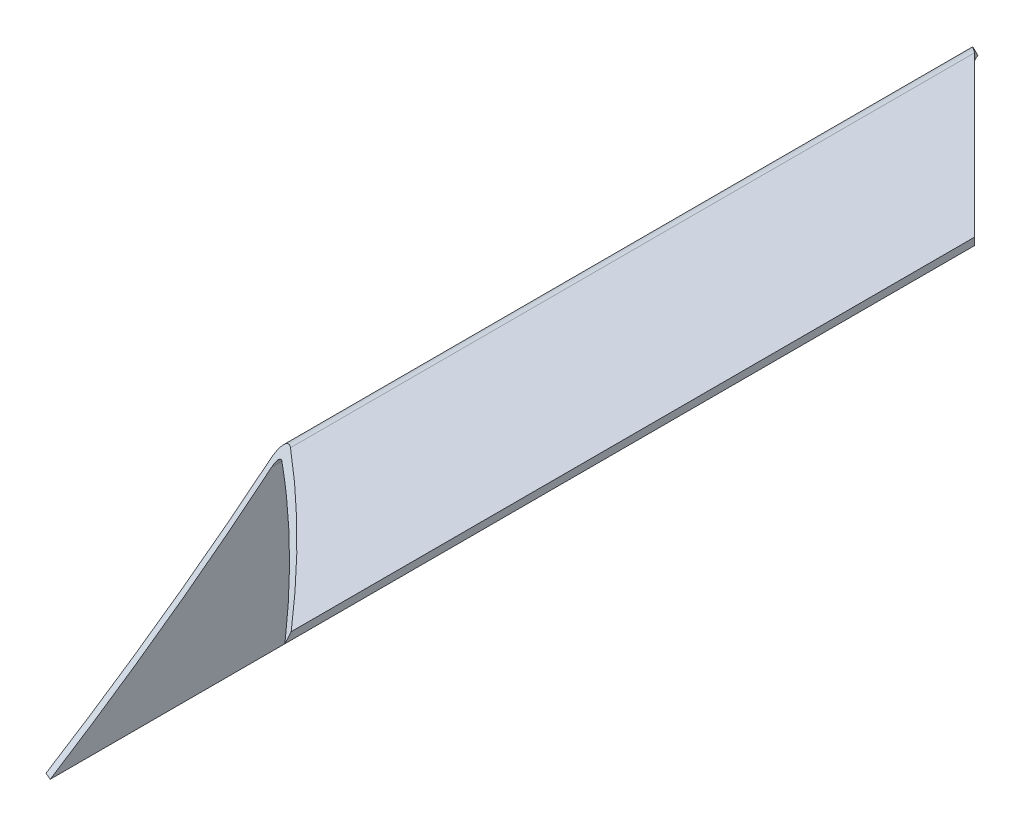
ISO-10303-21;
HEADER;
FILE_DESCRIPTION(('STEP AP214'),'2;1');
FILE_NAME('part.step','',(''),(''),'','','');
FILE_SCHEMA(('AUTOMOTIVE_DESIGN { 1 0 10303 214 1 1 1 1 }'));
ENDSEC;
DATA;
#1=APPLICATION_CONTEXT('core data for automotive mechanical design processes');
#2=APPLICATION_PROTOCOL_DEFINITION('international standard','automotive_design',2000,#1);
#3=PRODUCT_CONTEXT('',#1,'mechanical');
#4=PRODUCT('Part','Part','',(#3));
#5=PRODUCT_RELATED_PRODUCT_CATEGORY('part','',(#4));
#6=PRODUCT_DEFINITION_FORMATION('','',#4);
#7=PRODUCT_DEFINITION_CONTEXT('part definition',#1,'design');
#8=PRODUCT_DEFINITION('design','',#6,#7);
#9=PRODUCT_DEFINITION_SHAPE('','',#8);
#10=(LENGTH_UNIT() NAMED_UNIT(*) SI_UNIT(.MILLI.,.METRE.));
#11=(NAMED_UNIT(*) PLANE_ANGLE_UNIT() SI_UNIT($,.RADIAN.));
#12=(NAMED_UNIT(*) SI_UNIT($,.STERADIAN.) SOLID_ANGLE_UNIT());
#13=UNCERTAINTY_MEASURE_WITH_UNIT(LENGTH_MEASURE(1.E-05),#10,'distance_accuracy_value','');
#14=(GEOMETRIC_REPRESENTATION_CONTEXT(3) GLOBAL_UNCERTAINTY_ASSIGNED_CONTEXT((#13)) GLOBAL_UNIT_ASSIGNED_CONTEXT((#10,
#11,#12)) REPRESENTATION_CONTEXT('',''));
#15=CARTESIAN_POINT('',(0.,0.,0.));
#16=DIRECTION('',(0.,0.,1.));
#17=DIRECTION('',(1.,0.,0.));
#18=AXIS2_PLACEMENT_3D('',#15,#16,#17);
#19=CARTESIAN_POINT('',(-75.3461789999995,0.188336430725022,0.));
#20=DIRECTION('',(-1.,0.,0.));
#21=DIRECTION('',(0.,0.,1.));
#22=AXIS2_PLACEMENT_3D('',#19,#20,#21);
#23=PLANE('',#22);
#24=CARTESIAN_POINT('',(-75.3461790000001,85.4549348179387,59.5929013098399));
#25=DIRECTION('',(-1.,0.,0.));
#26=DIRECTION('',(0.,0.44262452655922,-0.896707047194471));
#27=AXIS2_PLACEMENT_3D('',#24,#25,#26);
#28=ELLIPSE('',#27,107.554363776843,44.45);
#29=CARTESIAN_POINT('',(-75.346179,73.8729789999997,-4.61638965902758));
#30=VERTEX_POINT('',#29);
#31=CARTESIAN_POINT('',(-75.3461789999999,57.8815154307375,17.83430043027));
#32=VERTEX_POINT('',#31);
#33=EDGE_CURVE('E103',#30,#32,#28,.T.);
#34=ORIENTED_EDGE('',*,*,#33,.F.);
#35=DIRECTION('',(0.,0.,-1.));
#36=VECTOR('',#35,1.);
#37=CARTESIAN_POINT('',(-75.346179,73.8729789999997,0.));
#38=LINE('',#37,#36);
#39=CARTESIAN_POINT('',(-75.346179,73.8729789999998,-73.6846425692606));
#40=VERTEX_POINT('',#39);
#41=EDGE_CURVE('E41',#30,#40,#38,.T.);
#42=ORIENTED_EDGE('',*,*,#41,.T.);
#43=DIRECTION('',(0.,0.707106781186615,-0.70710678118648));
#44=VECTOR('',#43,1.);
#45=CARTESIAN_POINT('',(-75.346179,74.7407654307376,-74.5524289999983));
#46=LINE('',#45,#44);
#47=CARTESIAN_POINT('',(-75.3461789999999,57.8815154307376,-57.6931790000015));
#48=VERTEX_POINT('',#47);
#49=EDGE_CURVE('E135',#48,#40,#46,.T.);
#50=ORIENTED_EDGE('',*,*,#49,.F.);
#51=DIRECTION('',(0.,0.,-1.));
#52=VECTOR('',#51,1.);
#53=CARTESIAN_POINT('',(-75.3461789999999,57.8815154307375,57.6931790000015));
#54=LINE('',#53,#52);
#55=EDGE_CURVE('E108',#32,#48,#54,.T.);
#56=ORIENTED_EDGE('',*,*,#55,.F.);
#57=EDGE_LOOP('',(#34,#42,#50,#56));
#58=FACE_BOUND('',#57,.T.);
#59=ADVANCED_FACE('F32',(#58),#23,.T.);
#60=CARTESIAN_POINT('',(-74.6095789999999,57.8815154307375,57.6931790000015));
#61=DIRECTION('',(0.,1.,0.));
#62=DIRECTION('',(0.,0.,1.));
#63=AXIS2_PLACEMENT_3D('',#60,#61,#62);
#64=PLANE('',#63);
#65=DIRECTION('',(0.,0.,-1.));
#66=VECTOR('',#65,1.);
#67=CARTESIAN_POINT('',(-74.6095789999999,57.8815154307375,57.6931790000015));
#68=LINE('',#67,#66);
#69=CARTESIAN_POINT('',(-74.6095789999999,57.8815154307375,18.1457516739195));
#70=VERTEX_POINT('',#69);
#71=CARTESIAN_POINT('',(-74.6095789999999,57.8815154307376,-57.6931790000015));
#72=VERTEX_POINT('',#71);
#73=EDGE_CURVE('E137',#70,#72,#68,.T.);
#74=ORIENTED_EDGE('',*,*,#73,.F.);
#75=CARTESIAN_POINT('',(-47.0733548319775,57.8815154307377,115.453519048211));
#76=DIRECTION('',(0.,1.,0.));
#77=DIRECTION('',(-0.451584874767386,0.,-0.892228166379724));
#78=AXIS2_PLACEMENT_3D('',#75,#76,#77);
#79=ELLIPSE('',#78,110.282499709763,44.45);
#80=EDGE_CURVE('E224',#70,#32,#79,.T.);
#81=ORIENTED_EDGE('',*,*,#80,.T.);
#82=ORIENTED_EDGE('',*,*,#55,.T.);
#83=DIRECTION('',(-1.,0.,0.));
#84=VECTOR('',#83,1.);
#85=CARTESIAN_POINT('',(-74.6095789999999,57.8815154307376,-57.6931790000015));
#86=LINE('',#85,#84);
#87=EDGE_CURVE('E338',#72,#48,#86,.T.);
#88=ORIENTED_EDGE('',*,*,#87,.F.);
#89=EDGE_LOOP('',(#74,#81,#82,#88));
#90=FACE_BOUND('',#89,.T.);
#91=ADVANCED_FACE('F156',(#90),#64,.F.);
#92=CARTESIAN_POINT('',(-74.609579,74.7407654307376,-74.5524289999983));
#93=DIRECTION('',(0.,0.70710678118648,0.707106781186615));
#94=DIRECTION('',(0.,-0.707106781186615,0.70710678118648));
#95=AXIS2_PLACEMENT_3D('',#92,#93,#94);
#96=PLANE('',#95);
#97=CARTESIAN_POINT('',(-74.609579,73.8729789999998,-73.6846425692607));
#98=CARTESIAN_POINT('',(-75.346179,73.8729789999998,-73.6846425692607));
#99=B_SPLINE_CURVE_WITH_KNOTS('',1,(#97,#98),.UNSPECIFIED.,.F.,.F.,(2,2),(0.,1.),.UNSPECIFIED.);
#100=CARTESIAN_POINT('',(-74.609579,73.8729789999998,-73.6846425692607));
#101=VERTEX_POINT('',#100);
#102=EDGE_CURVE('E118',#101,#40,#99,.T.);
#103=ORIENTED_EDGE('',*,*,#102,.F.);
#104=DIRECTION('',(0.,0.707106781186615,-0.70710678118648));
#105=VECTOR('',#104,1.);
#106=CARTESIAN_POINT('',(-74.609579,74.7407654307376,-74.5524289999983));
#107=LINE('',#106,#105);
#108=EDGE_CURVE('E336',#72,#101,#107,.T.);
#109=ORIENTED_EDGE('',*,*,#108,.F.);
#110=ORIENTED_EDGE('',*,*,#87,.T.);
#111=ORIENTED_EDGE('',*,*,#49,.T.);
#112=EDGE_LOOP('',(#103,#109,#110,#111));
#113=FACE_BOUND('',#112,.T.);
#114=ADVANCED_FACE('F146',(#113),#96,.F.);
#115=CARTESIAN_POINT('',(-74.6095789999995,0.188336430725022,0.));
#116=DIRECTION('',(-1.,0.,0.));
#117=DIRECTION('',(0.,0.,1.));
#118=AXIS2_PLACEMENT_3D('',#115,#116,#117);
#119=PLANE('',#118);
#120=DIRECTION('',(0.,0.,-1.));
#121=VECTOR('',#120,1.);
#122=CARTESIAN_POINT('',(-74.609579,73.8729789999997,0.));
#123=LINE('',#122,#121);
#124=CARTESIAN_POINT('',(-74.609579,73.8729789999997,-4.03421915558087));
#125=VERTEX_POINT('',#124);
#126=EDGE_CURVE('E35',#125,#101,#123,.T.);
#127=ORIENTED_EDGE('',*,*,#126,.F.);
#128=CARTESIAN_POINT('',(-74.6095790000001,84.7365566113644,61.0482540111319));
#129=DIRECTION('',(-1.,0.,0.));
#130=DIRECTION('',(0.,0.44262452655922,-0.896707047194471));
#131=AXIS2_PLACEMENT_3D('',#128,#129,#130);
#132=ELLIPSE('',#131,107.554363776843,44.45);
#133=EDGE_CURVE('E232',#125,#70,#132,.T.);
#134=ORIENTED_EDGE('',*,*,#133,.T.);
#135=ORIENTED_EDGE('',*,*,#73,.T.);
#136=ORIENTED_EDGE('',*,*,#108,.T.);
#137=EDGE_LOOP('',(#127,#134,#135,#136));
#138=FACE_BOUND('',#137,.T.);
#139=ADVANCED_FACE('F155',(#138),#119,.F.);
#140=CARTESIAN_POINT('',(-57.8815154307379,74.6095789999998,57.6931790000015));
#141=DIRECTION('',(-1.,0.,0.));
#142=DIRECTION('',(0.,0.,-1.));
#143=AXIS2_PLACEMENT_3D('',#140,#141,#142);
#144=PLANE('',#143);
#145=DIRECTION('',(0.,0.,1.));
#146=VECTOR('',#145,1.);
#147=CARTESIAN_POINT('',(-57.8815154307379,75.3461789999998,57.6931790000015));
#148=LINE('',#147,#146);
#149=CARTESIAN_POINT('',(-57.8815154307379,75.3461789999998,-57.6931790000015));
#150=VERTEX_POINT('',#149);
#151=CARTESIAN_POINT('',(-57.8815154307379,75.3461789999998,10.7426429674293));
#152=VERTEX_POINT('',#151);
#153=EDGE_CURVE('E200',#150,#152,#148,.T.);
#154=ORIENTED_EDGE('',*,*,#153,.T.);
#155=CARTESIAN_POINT('',(-57.8815154307379,68.4223069421463,94.0990719624069));
#156=DIRECTION('',(-1.,0.,0.));
#157=DIRECTION('',(0.,0.442624526559218,-0.896707047194471));
#158=AXIS2_PLACEMENT_3D('',#155,#156,#157);
#159=ELLIPSE('',#158,107.554363776842,44.45);
#160=CARTESIAN_POINT('',(-57.8815154307379,74.6095789999998,11.3730987476656));
#161=VERTEX_POINT('',#160);
#162=EDGE_CURVE('E110',#152,#161,#159,.T.);
#163=ORIENTED_EDGE('',*,*,#162,.T.);
#164=DIRECTION('',(0.,0.,1.));
#165=VECTOR('',#164,1.);
#166=CARTESIAN_POINT('',(-57.8815154307379,74.6095789999998,57.6931790000015));
#167=LINE('',#166,#165);
#168=CARTESIAN_POINT('',(-57.8815154307379,74.6095789999998,-57.6931790000015));
#169=VERTEX_POINT('',#168);
#170=EDGE_CURVE('E198',#169,#161,#167,.T.);
#171=ORIENTED_EDGE('',*,*,#170,.F.);
#172=DIRECTION('',(0.,1.,0.));
#173=VECTOR('',#172,1.);
#174=CARTESIAN_POINT('',(-57.8815154307379,74.6095789999998,-57.6931790000015));
#175=LINE('',#174,#173);
#176=EDGE_CURVE('E193',#169,#150,#175,.T.);
#177=ORIENTED_EDGE('',*,*,#176,.T.);
#178=EDGE_LOOP('',(#154,#163,#171,#177));
#179=FACE_BOUND('',#178,.T.);
#180=ADVANCED_FACE('F159',(#179),#144,.F.);
#181=CARTESIAN_POINT('',(-149.29319443075,74.6095789999995,0.));
#182=DIRECTION('',(0.,1.,0.));
#183=DIRECTION('',(0.,0.,1.));
#184=AXIS2_PLACEMENT_3D('',#181,#182,#183);
#185=PLANE('',#184);
#186=ORIENTED_EDGE('',*,*,#170,.T.);
#187=CARTESIAN_POINT('',(-64.2257287658678,74.6095789999998,81.5643611086821));
#188=DIRECTION('',(0.,1.,0.));
#189=DIRECTION('',(-0.451584874767387,0.,-0.892228166379724));
#190=AXIS2_PLACEMENT_3D('',#187,#188,#189);
#191=ELLIPSE('',#190,110.282499709764,44.45);
#192=CARTESIAN_POINT('',(-73.872979,74.6095789999997,-4.31435850863745));
#193=VERTEX_POINT('',#192);
#194=EDGE_CURVE('E109',#161,#193,#191,.T.);
#195=ORIENTED_EDGE('',*,*,#194,.T.);
#196=DIRECTION('',(0.,0.,-1.));
#197=VECTOR('',#196,1.);
#198=CARTESIAN_POINT('',(-73.872979,74.6095789999997,0.));
#199=LINE('',#198,#197);
#200=CARTESIAN_POINT('',(-73.872979,74.6095789999998,-73.6846425692607));
#201=VERTEX_POINT('',#200);
#202=EDGE_CURVE('E192',#193,#201,#199,.T.);
#203=ORIENTED_EDGE('',*,*,#202,.T.);
#204=DIRECTION('',(0.707106781186614,0.,0.707106781186481));
#205=VECTOR('',#204,1.);
#206=CARTESIAN_POINT('',(-74.7407654307379,74.6095789999998,-74.5524289999983));
#207=LINE('',#206,#205);
#208=EDGE_CURVE('E190',#201,#169,#207,.T.);
#209=ORIENTED_EDGE('',*,*,#208,.T.);
#210=EDGE_LOOP('',(#186,#195,#203,#209));
#211=FACE_BOUND('',#210,.T.);
#212=ADVANCED_FACE('F173',(#211),#185,.F.);
#213=CARTESIAN_POINT('',(-74.7407654307379,74.6095789999998,-74.5524289999983));
#214=DIRECTION('',(-0.707106781186481,0.,0.707106781186614));
#215=DIRECTION('',(-0.707106781186614,0.,-0.707106781186481));
#216=AXIS2_PLACEMENT_3D('',#213,#214,#215);
#217=PLANE('',#216);
#218=ORIENTED_EDGE('',*,*,#208,.F.);
#219=CARTESIAN_POINT('',(-73.872979,75.3461789999998,-73.6846425692607));
#220=CARTESIAN_POINT('',(-73.872979,74.6095789999998,-73.6846425692607));
#221=B_SPLINE_CURVE_WITH_KNOTS('',1,(#219,#220),.UNSPECIFIED.,.F.,.F.,(2,2),(0.,1.),.UNSPECIFIED.);
#222=CARTESIAN_POINT('',(-73.872979,75.3461789999998,-73.6846425692606));
#223=VERTEX_POINT('',#222);
#224=EDGE_CURVE('E213',#201,#223,#221,.F.);
#225=ORIENTED_EDGE('',*,*,#224,.T.);
#226=DIRECTION('',(0.707106781186614,0.,0.707106781186481));
#227=VECTOR('',#226,1.);
#228=CARTESIAN_POINT('',(-74.7407654307379,75.3461789999998,-74.5524289999983));
#229=LINE('',#228,#227);
#230=EDGE_CURVE('E212',#223,#150,#229,.T.);
#231=ORIENTED_EDGE('',*,*,#230,.T.);
#232=ORIENTED_EDGE('',*,*,#176,.F.);
#233=EDGE_LOOP('',(#218,#225,#231,#232));
#234=FACE_BOUND('',#233,.T.);
#235=ADVANCED_FACE('F168',(#234),#217,.F.);
#236=CARTESIAN_POINT('',(-149.29319443075,75.3461789999995,0.));
#237=DIRECTION('',(0.,1.,0.));
#238=DIRECTION('',(0.,0.,1.));
#239=AXIS2_PLACEMENT_3D('',#236,#237,#238);
#240=PLANE('',#239);
#241=CARTESIAN_POINT('',(-64.9810127583868,75.3461789999998,80.072093122319));
#242=DIRECTION('',(0.,1.,0.));
#243=DIRECTION('',(-0.451584874767387,0.,-0.892228166379724));
#244=AXIS2_PLACEMENT_3D('',#241,#242,#243);
#245=ELLIPSE('',#244,110.282499709764,44.45);
#246=CARTESIAN_POINT('',(-73.872979,75.3461789999998,-5.17624663550996));
#247=VERTEX_POINT('',#246);
#248=EDGE_CURVE('E49',#152,#247,#245,.T.);
#249=ORIENTED_EDGE('',*,*,#248,.F.);
#250=ORIENTED_EDGE('',*,*,#153,.F.);
#251=ORIENTED_EDGE('',*,*,#230,.F.);
#252=DIRECTION('',(0.,0.,-1.));
#253=VECTOR('',#252,1.);
#254=CARTESIAN_POINT('',(-73.872979,75.3461789999998,0.));
#255=LINE('',#254,#253);
#256=EDGE_CURVE('E123',#247,#223,#255,.T.);
#257=ORIENTED_EDGE('',*,*,#256,.F.);
#258=EDGE_LOOP('',(#249,#250,#251,#257));
#259=FACE_BOUND('',#258,.T.);
#260=ADVANCED_FACE('F164',(#259),#240,.T.);
#261=CARTESIAN_POINT('',(-75.346179,73.8729789999998,-73.6846425692607));
#262=CARTESIAN_POINT('',(-75.346179,74.0658426810747,-73.8292903300669));
#263=CARTESIAN_POINT('',(-75.3078355472678,74.2585859832379,-73.9739047128399));
#264=CARTESIAN_POINT('',(-75.1602411073235,74.6149104818822,-74.2631668564191));
#265=CARTESIAN_POINT('',(-75.0510639267768,74.7783134933111,-74.4077812391921));
#266=CARTESIAN_POINT('',(-74.9146887100441,74.9146887100438,-74.5524289999983));
#267=CARTESIAN_POINT('',(-74.609579,73.8729789999998,-73.6846425692607));
#268=CARTESIAN_POINT('',(-74.609579,73.96940506357,-73.829281664616));
#269=CARTESIAN_POINT('',(-74.5904072736339,74.0657824916188,-73.9739047128399));
#270=CARTESIAN_POINT('',(-74.5166100536618,74.243944740941,-74.2631668564191));
#271=CARTESIAN_POINT('',(-74.4620173784557,74.3256503315882,-74.407789904643));
#272=CARTESIAN_POINT('',(-74.3938338550221,74.3938338550218,-74.5524289999983));
#273=B_SPLINE_SURFACE_WITH_KNOTS('',1,3,((#261,#262,#263,#264,#265,#266),(#267,#268,#269,#270,
#271,#272)),.UNSPECIFIED.,.F.,.F.,.F.,(2,2),(4,2,4),(0.,1.),(0.,0.5,1.),.UNSPECIFIED.);
#274=CARTESIAN_POINT('',(-75.346179,73.8729789999998,-73.6846425692607));
#275=CARTESIAN_POINT('',(-75.346179,74.0658426810747,-73.8292903300669));
#276=CARTESIAN_POINT('',(-75.3078355472678,74.2585859832379,-73.9739047128399));
#277=CARTESIAN_POINT('',(-75.1602411073235,74.6149104818822,-74.2631668564191));
#278=CARTESIAN_POINT('',(-75.0510639267768,74.7783134933111,-74.4077812391921));
#279=CARTESIAN_POINT('',(-74.9146887100441,74.9146887100438,-74.5524289999983));
#280=B_SPLINE_CURVE_WITH_KNOTS('',3,(#274,#275,#276,#277,#278,#279),.UNSPECIFIED.,.F.,.F.,(4,2,
4),(0.,0.5,1.),.UNSPECIFIED.);
#281=CARTESIAN_POINT('',(-74.9146889457464,74.9146884743413,-74.5524287499982));
#282=VERTEX_POINT('',#281);
#283=EDGE_CURVE('E116',#40,#282,#280,.T.);
#284=CARTESIAN_POINT('',(-74.9146887100441,74.9146887100438,-74.5524289999983));
#285=CARTESIAN_POINT('',(-74.3938338550221,74.3938338550218,-74.5524289999983));
#286=B_SPLINE_CURVE_WITH_KNOTS('',1,(#284,#285),.UNSPECIFIED.,.F.,.F.,(2,2),(0.,1.),.UNSPECIFIED.);
#287=CARTESIAN_POINT('',(-74.3938338550221,74.3938338550218,-74.5524289999983));
#288=VERTEX_POINT('',#287);
#289=EDGE_CURVE('E354',#282,#288,#286,.T.);
#290=CARTESIAN_POINT('',(-74.3938338550221,74.3938338550218,-74.5524289999983));
#291=CARTESIAN_POINT('',(-74.4620173784557,74.3256503315882,-74.407789904643));
#292=CARTESIAN_POINT('',(-74.5166100536618,74.243944740941,-74.2631668564191));
#293=CARTESIAN_POINT('',(-74.5904072736339,74.0657824916188,-73.9739047128399));
#294=CARTESIAN_POINT('',(-74.609579,73.96940506357,-73.829281664616));
#295=CARTESIAN_POINT('',(-74.609579,73.8729789999998,-73.6846425692607));
#296=B_SPLINE_CURVE_WITH_KNOTS('',3,(#290,#291,#292,#293,#294,#295),.UNSPECIFIED.,.F.,.F.,(4,2,
4),(0.,0.5,1.),.UNSPECIFIED.);
#297=EDGE_CURVE('E349',#101,#288,#296,.F.);
#298=ORIENTED_EDGE('',*,*,#102,.T.);
#299=ORIENTED_EDGE('',*,*,#283,.T.);
#300=ORIENTED_EDGE('',*,*,#289,.T.);
#301=ORIENTED_EDGE('',*,*,#297,.F.);
#302=EDGE_LOOP('',(#298,#299,#300,#301));
#303=FACE_BOUND('',#302,.T.);
#304=ADVANCED_FACE('F167',(#303),#273,.F.);
#305=CARTESIAN_POINT('',(-74.9146887100441,74.9146887100438,-74.5524289999983));
#306=CARTESIAN_POINT('',(-74.7783134933113,75.0510639267765,-74.4077812391921));
#307=CARTESIAN_POINT('',(-74.6149104818825,75.1602411073232,-74.2631668564191));
#308=CARTESIAN_POINT('',(-74.2585859832381,75.3078355472675,-73.9739047128399));
#309=CARTESIAN_POINT('',(-74.065842681075,75.3461789999998,-73.8292903300669));
#310=CARTESIAN_POINT('',(-73.872979,75.3461789999998,-73.6846425692607));
#311=CARTESIAN_POINT('',(-74.3938338550221,74.3938338550218,-74.5524289999983));
#312=CARTESIAN_POINT('',(-74.3256503315884,74.4620173784554,-74.407789904643));
#313=CARTESIAN_POINT('',(-74.2439447409412,74.5166100536615,-74.2631668564191));
#314=CARTESIAN_POINT('',(-74.0657824916191,74.5904072736337,-73.9739047128399));
#315=CARTESIAN_POINT('',(-73.9694050635702,74.6095789999998,-73.8292816646159));
#316=CARTESIAN_POINT('',(-73.872979,74.6095789999998,-73.6846425692607));
#317=B_SPLINE_SURFACE_WITH_KNOTS('',1,3,((#305,#306,#307,#308,#309,#310),(#311,#312,#313,#314,
#315,#316)),.UNSPECIFIED.,.F.,.F.,.F.,(2,2),(4,2,4),(0.,1.),(0.,0.5,1.),.UNSPECIFIED.);
#318=CARTESIAN_POINT('',(-74.9146887100441,74.9146887100438,-74.5524289999983));
#319=CARTESIAN_POINT('',(-74.7783134933113,75.0510639267765,-74.4077812391921));
#320=CARTESIAN_POINT('',(-74.6149104818825,75.1602411073232,-74.2631668564191));
#321=CARTESIAN_POINT('',(-74.2585859832381,75.3078355472675,-73.9739047128399));
#322=CARTESIAN_POINT('',(-74.065842681075,75.3461789999998,-73.8292903300669));
#323=CARTESIAN_POINT('',(-73.872979,75.3461789999998,-73.6846425692607));
#324=B_SPLINE_CURVE_WITH_KNOTS('',3,(#318,#319,#320,#321,#322,#323),.UNSPECIFIED.,.F.,.F.,(4,2,
4),(0.,0.5,1.),.UNSPECIFIED.);
#325=EDGE_CURVE('E346',#282,#223,#324,.T.);
#326=CARTESIAN_POINT('',(-73.872979,74.6095789999998,-73.6846425692607));
#327=CARTESIAN_POINT('',(-73.9694050635702,74.6095789999998,-73.8292816646159));
#328=CARTESIAN_POINT('',(-74.0657824916191,74.5904072736337,-73.9739047128399));
#329=CARTESIAN_POINT('',(-74.2439447409412,74.5166100536615,-74.2631668564191));
#330=CARTESIAN_POINT('',(-74.3256503315884,74.4620173784554,-74.407789904643));
#331=CARTESIAN_POINT('',(-74.3938338550221,74.3938338550218,-74.5524289999983));
#332=B_SPLINE_CURVE_WITH_KNOTS('',3,(#326,#327,#328,#329,#330,#331),.UNSPECIFIED.,.F.,.F.,(4,2,
4),(0.,0.5,1.),.UNSPECIFIED.);
#333=EDGE_CURVE('E351',#288,#201,#332,.F.);
#334=ORIENTED_EDGE('',*,*,#289,.F.);
#335=ORIENTED_EDGE('',*,*,#325,.T.);
#336=ORIENTED_EDGE('',*,*,#224,.F.);
#337=ORIENTED_EDGE('',*,*,#333,.F.);
#338=EDGE_LOOP('',(#334,#335,#336,#337));
#339=FACE_BOUND('',#338,.T.);
#340=ADVANCED_FACE('F283',(#339),#317,.F.);
#341=CARTESIAN_POINT('',(-73.8729790000001,73.8729789999997,149.116777969203));
#342=DIRECTION('',(0.,0.,-1.));
#343=DIRECTION('',(1.,0.,0.));
#344=AXIS2_PLACEMENT_3D('',#341,#342,#343);
#345=CYLINDRICAL_SURFACE('',#344,0.7366);
#346=CARTESIAN_POINT('',(-74.609579,73.8729789999997,-4.03421915558087));
#347=CARTESIAN_POINT('',(-74.6095712351742,73.8926459537735,-4.05796945835561));
#348=CARTESIAN_POINT('',(-74.6087906288021,73.9126313173264,-4.08147644635874));
#349=CARTESIAN_POINT('',(-74.6054752514798,73.9532859897057,-4.12788389374061));
#350=CARTESIAN_POINT('',(-74.6029353052995,73.9739571445892,-4.15078235620699));
#351=CARTESIAN_POINT('',(-74.5958477424562,74.0161681532257,-4.19598224922583));
#352=CARTESIAN_POINT('',(-74.5912761925967,74.0377154940909,-4.21827309587718));
#353=CARTESIAN_POINT('',(-74.5798468327943,74.0813683449708,-4.26164617901915));
#354=CARTESIAN_POINT('',(-74.5729919616871,74.1034731039092,-4.2827299284812));
#355=CARTESIAN_POINT('',(-74.5560211017539,74.1499101322972,-4.32489604052319));
#356=CARTESIAN_POINT('',(-74.5456938611269,74.1742824370995,-4.34585212578479));
#357=CARTESIAN_POINT('',(-74.52150176736,74.2233268292664,-4.38519083213067));
#358=CARTESIAN_POINT('',(-74.5076424259713,74.2479983930307,-4.40357739429573));
#359=CARTESIAN_POINT('',(-74.4756224453201,74.2975783587998,-4.43705754306382));
#360=CARTESIAN_POINT('',(-74.4573988659186,74.3224845587556,-4.45209607020197));
#361=CARTESIAN_POINT('',(-74.4164815119713,74.3711597885065,-4.4770663920283));
#362=CARTESIAN_POINT('',(-74.393802455808,74.3949322505571,-4.48701462230916));
#363=CARTESIAN_POINT('',(-74.3519553325362,74.4330703580573,-4.49842004787448));
#364=CARTESIAN_POINT('',(-74.3338316641291,74.448090916126,-4.50154286836818));
#365=CARTESIAN_POINT('',(-74.2960455056544,74.4764277070372,-4.50443916837436));
#366=CARTESIAN_POINT('',(-74.2763835987432,74.4897445807604,-4.50421391110317));
#367=CARTESIAN_POINT('',(-74.2361336313403,74.5142695332897,-4.50043770655478));
#368=CARTESIAN_POINT('',(-74.2155468215603,74.5254803596305,-4.4968911289352));
#369=CARTESIAN_POINT('',(-74.174023436509,74.5456498944992,-4.48678347162814));
#370=CARTESIAN_POINT('',(-74.153086675341,74.5546073626795,-4.48022073730875));
#371=CARTESIAN_POINT('',(-74.1040236620422,74.5730532595513,-4.46177059473416));
#372=CARTESIAN_POINT('',(-74.0759527909377,74.581624898578,-4.44882281278274));
#373=CARTESIAN_POINT('',(-74.0207925467951,74.5951603202855,-4.41940251965902));
#374=CARTESIAN_POINT('',(-73.993706506406,74.6001127721252,-4.40291914594012));
#375=CARTESIAN_POINT('',(-73.9347751924337,74.6077059246756,-4.36324398654314));
#376=CARTESIAN_POINT('',(-73.9032671289175,74.6095535448119,-4.33938112130095));
#377=CARTESIAN_POINT('',(-73.872979,74.6095789999998,-4.31435850863742));
#378=B_SPLINE_CURVE_WITH_KNOTS('',3,(#346,#347,#348,#349,#350,#351,#352,#353,#354,#355,#356,
#357,#358,#359,#360,#361,#362,#363,#364,#365,#366,#367,#368,#369,#370,#371,#372,#373,#374,#375,
#376,#377),.UNSPECIFIED.,.F.,.F.,(4,2,2,2,2,2,2,2,2,2,2,2,2,2,2,4),(0.,0.0925195520080164,
0.185312419446687,0.279228664994538,0.373024496150509,0.474076167677351,0.574971106054297,
0.677419488811809,0.77953496429878,0.850450570799295,0.921339421804992,0.992135139522428,
1.0629697414715,1.15866221614868,1.25465301323385,1.3727089996416),.UNSPECIFIED.);
#379=EDGE_CURVE('E226',#125,#193,#378,.T.);
#380=ORIENTED_EDGE('',*,*,#379,.F.);
#381=ORIENTED_EDGE('',*,*,#126,.T.);
#382=ORIENTED_EDGE('',*,*,#297,.T.);
#383=ORIENTED_EDGE('',*,*,#333,.T.);
#384=ORIENTED_EDGE('',*,*,#202,.F.);
#385=EDGE_LOOP('',(#380,#381,#382,#383,#384));
#386=FACE_BOUND('',#385,.T.);
#387=ADVANCED_FACE('F234',(#386),#345,.F.);
#388=CARTESIAN_POINT('',(-73.8729790000001,73.8729789999997,149.116777969203));
#389=DIRECTION('',(0.,0.,-1.));
#390=DIRECTION('',(1.,0.,0.));
#391=AXIS2_PLACEMENT_3D('',#388,#389,#390);
#392=CYLINDRICAL_SURFACE('',#391,1.4732);
#393=ORIENTED_EDGE('',*,*,#41,.F.);
#394=CARTESIAN_POINT('',(-75.346179,73.8729789999997,-4.61638965902758));
#395=CARTESIAN_POINT('',(-75.3461633142574,73.9120149761491,-4.66411851076646));
#396=CARTESIAN_POINT('',(-75.3446260534157,73.9516762981758,-4.71137540747106));
#397=CARTESIAN_POINT('',(-75.3380980941316,74.0323523716817,-4.80470834175873));
#398=CARTESIAN_POINT('',(-75.3330973791012,74.0733707192984,-4.85078055127431));
#399=CARTESIAN_POINT('',(-75.3191456569558,74.1571287442032,-4.94176006699866));
#400=CARTESIAN_POINT('',(-75.3101486602455,74.1998830360134,-4.98664716965897));
#401=CARTESIAN_POINT('',(-75.2876515198836,74.2865269512709,-5.07405079456173));
#402=CARTESIAN_POINT('',(-75.2741570646599,74.3304150762744,-5.11657023256212));
#403=CARTESIAN_POINT('',(-75.2408529802471,74.4223372670598,-5.20138218042464));
#404=CARTESIAN_POINT('',(-75.2206674376461,74.4704465085922,-5.24345049628043));
#405=CARTESIAN_POINT('',(-75.1733860620932,74.5673563725357,-5.32257872851954));
#406=CARTESIAN_POINT('',(-75.1462999547153,74.6161559313434,-5.35964558235377));
#407=CARTESIAN_POINT('',(-75.0836895285884,74.7143718343299,-5.42734766025273));
#408=CARTESIAN_POINT('',(-75.0480425384703,74.7637862025034,-5.45787589554092));
#409=CARTESIAN_POINT('',(-74.96789746126,74.8605899980095,-5.50886584356967));
#410=CARTESIAN_POINT('',(-74.9234291410117,74.9079856012937,-5.52936062795709));
#411=CARTESIAN_POINT('',(-74.8413627164559,74.9841296219443,-5.55320135746718));
#412=CARTESIAN_POINT('',(-74.8058763290721,75.0141204504459,-5.559886971949));
#413=CARTESIAN_POINT('',(-74.7318039077026,75.0708553757371,-5.56660723154047));
#414=CARTESIAN_POINT('',(-74.6932190904629,75.0976007367531,-5.56664447479495));
#415=CARTESIAN_POINT('',(-74.6141344247515,75.1470203061996,-5.560077347835));
#416=CARTESIAN_POINT('',(-74.5736366372935,75.1696987753222,-5.55347997686253));
#417=CARTESIAN_POINT('',(-74.4918808189649,75.2106539952508,-5.53424050528479));
#418=CARTESIAN_POINT('',(-74.4506224328508,75.228928630108,-5.52159550759769));
#419=CARTESIAN_POINT('',(-74.3541971806348,75.2666319714668,-5.4859289366973));
#420=CARTESIAN_POINT('',(-74.2991161385093,75.2843046151234,-5.46083558319473));
#421=CARTESIAN_POINT('',(-74.1907274543424,75.3126018775108,-5.40359873622642));
#422=CARTESIAN_POINT('',(-74.1374267483602,75.3232014310073,-5.37143070152162));
#423=CARTESIAN_POINT('',(-74.0486583156986,75.3361389512877,-5.31218103693207));
#424=CARTESIAN_POINT('',(-74.0125350643894,75.339986637928,-5.28636423521364));
#425=CARTESIAN_POINT('',(-73.9417010574927,75.3450006588354,-5.23270876077392));
#426=CARTESIAN_POINT('',(-73.9069883709038,75.3461707889839,-5.20487300812186));
#427=CARTESIAN_POINT('',(-73.8729790000001,75.3461789999998,-5.17624663551));
#428=B_SPLINE_CURVE_WITH_KNOTS('',3,(#394,#395,#396,#397,#398,#399,#400,#401,#402,#403,#404,
#405,#406,#407,#408,#409,#410,#411,#412,#413,#414,#415,#416,#417,#418,#419,#420,#421,#422,#423,
#424,#425,#426,#427),.UNSPECIFIED.,.F.,.F.,(4,2,2,2,2,2,2,2,2,2,2,2,2,2,2,2,4),(0.,
0.184999543877099,0.370536367740194,0.55826603374364,0.745759152936068,0.946375691815406,
1.1467110333987,1.35010906583856,1.55283207897168,1.69302461994547,1.83316237436932,
1.97315244422018,2.11320964280612,2.30133004122633,2.49011359953051,2.62367212247515,
2.75704118639934),.UNSPECIFIED.);
#429=EDGE_CURVE('E11',#30,#247,#428,.T.);
#430=ORIENTED_EDGE('',*,*,#429,.T.);
#431=ORIENTED_EDGE('',*,*,#256,.T.);
#432=ORIENTED_EDGE('',*,*,#325,.F.);
#433=ORIENTED_EDGE('',*,*,#283,.F.);
#434=EDGE_LOOP('',(#393,#430,#431,#432,#433));
#435=FACE_BOUND('',#434,.T.);
#436=ADVANCED_FACE('F113',(#435),#392,.T.);
#437=CARTESIAN_POINT('',(-62.7202270366854,73.141319928313,84.5388873215049));
#438=DIRECTION('',(-0.413279372766564,0.403055789603802,-0.81654527768675));
#439=DIRECTION('',(-0.892228166379723,0.,0.451584874767388));
#440=AXIS2_PLACEMENT_3D('',#437,#438,#439);
#441=CYLINDRICAL_SURFACE('',#440,44.45);
#442=ORIENTED_EDGE('',*,*,#379,.T.);
#443=ORIENTED_EDGE('',*,*,#194,.F.);
#444=ORIENTED_EDGE('',*,*,#162,.F.);
#445=ORIENTED_EDGE('',*,*,#248,.T.);
#446=ORIENTED_EDGE('',*,*,#429,.F.);
#447=ORIENTED_EDGE('',*,*,#33,.T.);
#448=ORIENTED_EDGE('',*,*,#80,.F.);
#449=ORIENTED_EDGE('',*,*,#133,.F.);
#450=EDGE_LOOP('',(#442,#443,#444,#445,#446,#447,#448,#449));
#451=FACE_BOUND('',#450,.T.);
#452=ADVANCED_FACE('F102',(#451),#441,.F.);
#453=CLOSED_SHELL('',(#59,#91,#114,#139,#180,#212,#235,#260,#304,#340,#387,#436,#452));
#454=MANIFOLD_SOLID_BREP('B2',#453);
#455=ADVANCED_BREP_SHAPE_REPRESENTATION('',(#18,#454),#14);
#456=SHAPE_DEFINITION_REPRESENTATION(#9,#455);
ENDSEC;
END-ISO-10303-21;
